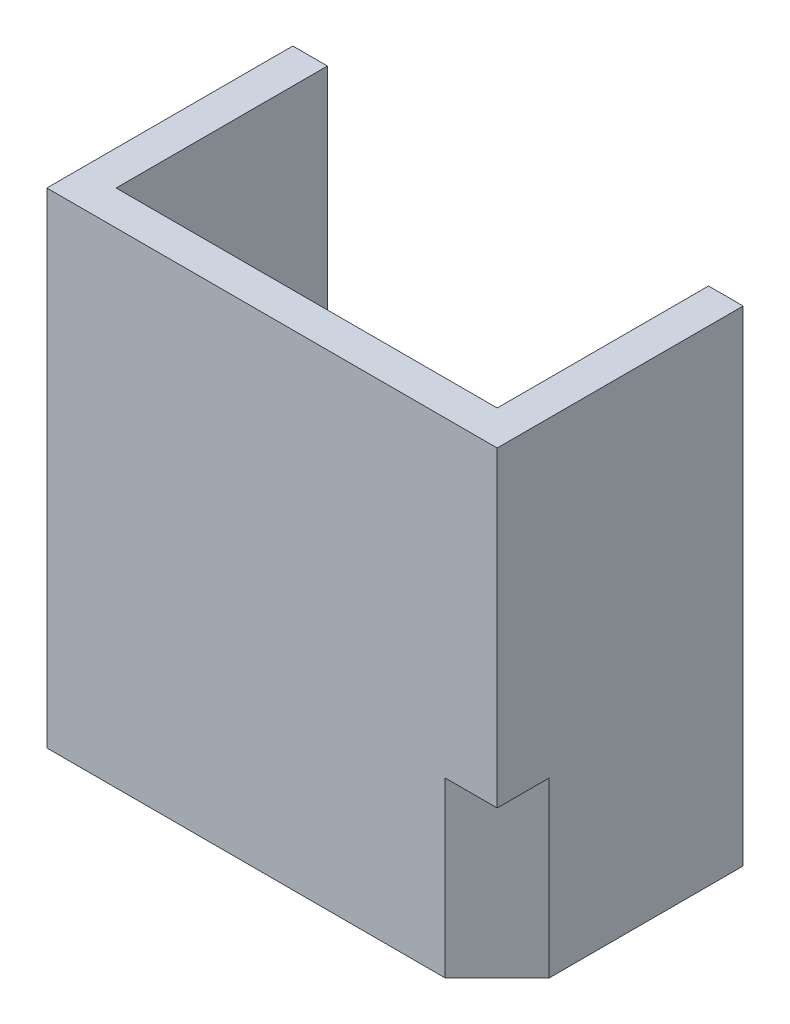
ISO-10303-21;
HEADER;
FILE_DESCRIPTION(('STEP AP214'),'2;1');
FILE_NAME('part.step','',(''),(''),'','','');
FILE_SCHEMA(('AUTOMOTIVE_DESIGN { 1 0 10303 214 1 1 1 1 }'));
ENDSEC;
DATA;
#1=APPLICATION_CONTEXT('core data for automotive mechanical design processes');
#2=APPLICATION_PROTOCOL_DEFINITION('international standard','automotive_design',2000,#1);
#3=PRODUCT_CONTEXT('',#1,'mechanical');
#4=PRODUCT('Part','Part','',(#3));
#5=PRODUCT_RELATED_PRODUCT_CATEGORY('part','',(#4));
#6=PRODUCT_DEFINITION_FORMATION('','',#4);
#7=PRODUCT_DEFINITION_CONTEXT('part definition',#1,'design');
#8=PRODUCT_DEFINITION('design','',#6,#7);
#9=PRODUCT_DEFINITION_SHAPE('','',#8);
#10=(LENGTH_UNIT() NAMED_UNIT(*) SI_UNIT(.MILLI.,.METRE.));
#11=(NAMED_UNIT(*) PLANE_ANGLE_UNIT() SI_UNIT($,.RADIAN.));
#12=(NAMED_UNIT(*) SI_UNIT($,.STERADIAN.) SOLID_ANGLE_UNIT());
#13=UNCERTAINTY_MEASURE_WITH_UNIT(LENGTH_MEASURE(1.E-05),#10,'distance_accuracy_value','');
#14=(GEOMETRIC_REPRESENTATION_CONTEXT(3) GLOBAL_UNCERTAINTY_ASSIGNED_CONTEXT((#13)) GLOBAL_UNIT_ASSIGNED_CONTEXT((#10,
#11,#12)) REPRESENTATION_CONTEXT('',''));
#15=CARTESIAN_POINT('',(0.,0.,0.));
#16=DIRECTION('',(0.,0.,1.));
#17=DIRECTION('',(1.,0.,0.));
#18=AXIS2_PLACEMENT_3D('',#15,#16,#17);
#19=CARTESIAN_POINT('',(130.,140.,0.));
#20=DIRECTION('',(-1.,0.,0.));
#21=DIRECTION('',(0.,0.,1.));
#22=AXIS2_PLACEMENT_3D('',#19,#20,#21);
#23=PLANE('',#22);
#24=DIRECTION('',(0.,-1.,0.));
#25=VECTOR('',#24,1.);
#26=CARTESIAN_POINT('',(130.,50.,-15.));
#27=LINE('',#26,#25);
#28=CARTESIAN_POINT('',(130.,50.,-15.));
#29=VERTEX_POINT('',#28);
#30=CARTESIAN_POINT('',(130.,0.,-15.));
#31=VERTEX_POINT('',#30);
#32=EDGE_CURVE('E177',#29,#31,#27,.T.);
#33=ORIENTED_EDGE('',*,*,#32,.T.);
#34=DIRECTION('',(0.,0.,-1.));
#35=VECTOR('',#34,1.);
#36=CARTESIAN_POINT('',(130.,0.,0.));
#37=LINE('',#36,#35);
#38=CARTESIAN_POINT('',(130.,0.,-71.));
#39=VERTEX_POINT('',#38);
#40=EDGE_CURVE('E290',#31,#39,#37,.T.);
#41=ORIENTED_EDGE('',*,*,#40,.T.);
#42=DIRECTION('',(0.,1.,0.));
#43=VECTOR('',#42,1.);
#44=CARTESIAN_POINT('',(130.,140.,-71.));
#45=LINE('',#44,#43);
#46=CARTESIAN_POINT('',(130.,140.,-71.));
#47=VERTEX_POINT('',#46);
#48=EDGE_CURVE('E211',#39,#47,#45,.T.);
#49=ORIENTED_EDGE('',*,*,#48,.T.);
#50=DIRECTION('',(0.,0.,-1.));
#51=VECTOR('',#50,1.);
#52=CARTESIAN_POINT('',(130.,140.,0.));
#53=LINE('',#52,#51);
#54=CARTESIAN_POINT('',(130.,140.,0.));
#55=VERTEX_POINT('',#54);
#56=EDGE_CURVE('E292',#55,#47,#53,.T.);
#57=ORIENTED_EDGE('',*,*,#56,.F.);
#58=DIRECTION('',(0.,-1.,0.));
#59=VECTOR('',#58,1.);
#60=CARTESIAN_POINT('',(130.,140.,0.));
#61=LINE('',#60,#59);
#62=CARTESIAN_POINT('',(130.,50.,0.));
#63=VERTEX_POINT('',#62);
#64=EDGE_CURVE('E194',#55,#63,#61,.T.);
#65=ORIENTED_EDGE('',*,*,#64,.T.);
#66=DIRECTION('',(0.,0.,-1.));
#67=VECTOR('',#66,1.);
#68=CARTESIAN_POINT('',(130.,50.,0.));
#69=LINE('',#68,#67);
#70=EDGE_CURVE('E64',#63,#29,#69,.T.);
#71=ORIENTED_EDGE('',*,*,#70,.T.);
#72=EDGE_LOOP('',(#33,#41,#49,#57,#65,#71));
#73=FACE_BOUND('',#72,.T.);
#74=ADVANCED_FACE('F49',(#73),#23,.F.);
#75=CARTESIAN_POINT('',(0.,0.,0.));
#76=DIRECTION('',(0.,-1.,0.));
#77=DIRECTION('',(0.,0.,-1.));
#78=AXIS2_PLACEMENT_3D('',#75,#76,#77);
#79=PLANE('',#78);
#80=ORIENTED_EDGE('',*,*,#40,.F.);
#81=DIRECTION('',(-0.707106781186547,0.,0.707106781186547));
#82=VECTOR('',#81,1.);
#83=CARTESIAN_POINT('',(130.,0.,-15.));
#84=LINE('',#83,#82);
#85=CARTESIAN_POINT('',(115.,0.,0.));
#86=VERTEX_POINT('',#85);
#87=EDGE_CURVE('E181',#31,#86,#84,.T.);
#88=ORIENTED_EDGE('',*,*,#87,.T.);
#89=DIRECTION('',(1.,0.,0.));
#90=VECTOR('',#89,1.);
#91=CARTESIAN_POINT('',(0.,0.,0.));
#92=LINE('',#91,#90);
#93=CARTESIAN_POINT('',(0.,0.,0.));
#94=VERTEX_POINT('',#93);
#95=EDGE_CURVE('E296',#94,#86,#92,.T.);
#96=ORIENTED_EDGE('',*,*,#95,.F.);
#97=DIRECTION('',(0.,0.,1.));
#98=VECTOR('',#97,1.);
#99=CARTESIAN_POINT('',(0.,0.,0.));
#100=LINE('',#99,#98);
#101=CARTESIAN_POINT('',(0.,0.,-70.9999999999999));
#102=VERTEX_POINT('',#101);
#103=EDGE_CURVE('E284',#102,#94,#100,.T.);
#104=ORIENTED_EDGE('',*,*,#103,.F.);
#105=DIRECTION('',(1.,0.,0.));
#106=VECTOR('',#105,1.);
#107=CARTESIAN_POINT('',(130.,0.,-71.));
#108=LINE('',#107,#106);
#109=CARTESIAN_POINT('',(10.,0.,-71.));
#110=VERTEX_POINT('',#109);
#111=EDGE_CURVE('E215',#102,#110,#108,.T.);
#112=ORIENTED_EDGE('',*,*,#111,.T.);
#113=DIRECTION('',(0.,0.,-1.));
#114=VECTOR('',#113,1.);
#115=CARTESIAN_POINT('',(9.99999999999999,0.,0.));
#116=LINE('',#115,#114);
#117=CARTESIAN_POINT('',(9.99999999999999,0.,-10.));
#118=VERTEX_POINT('',#117);
#119=EDGE_CURVE('E230',#118,#110,#116,.T.);
#120=ORIENTED_EDGE('',*,*,#119,.F.);
#121=DIRECTION('',(-1.,0.,0.));
#122=VECTOR('',#121,1.);
#123=CARTESIAN_POINT('',(0.,0.,-10.));
#124=LINE('',#123,#122);
#125=CARTESIAN_POINT('',(120.,0.,-10.));
#126=VERTEX_POINT('',#125);
#127=EDGE_CURVE('E234',#126,#118,#124,.T.);
#128=ORIENTED_EDGE('',*,*,#127,.F.);
#129=DIRECTION('',(0.,0.,1.));
#130=VECTOR('',#129,1.);
#131=CARTESIAN_POINT('',(120.,0.,0.));
#132=LINE('',#131,#130);
#133=CARTESIAN_POINT('',(120.,0.,-71.));
#134=VERTEX_POINT('',#133);
#135=EDGE_CURVE('E237',#134,#126,#132,.T.);
#136=ORIENTED_EDGE('',*,*,#135,.F.);
#137=EDGE_CURVE('E214',#134,#39,#108,.T.);
#138=ORIENTED_EDGE('',*,*,#137,.T.);
#139=EDGE_LOOP('',(#80,#88,#96,#104,#112,#120,#128,#136,#138));
#140=FACE_BOUND('',#139,.T.);
#141=ADVANCED_FACE('F323',(#140),#79,.T.);
#142=CARTESIAN_POINT('',(0.,140.,0.));
#143=DIRECTION('',(0.,0.,-1.));
#144=DIRECTION('',(-1.,0.,0.));
#145=AXIS2_PLACEMENT_3D('',#142,#143,#144);
#146=PLANE('',#145);
#147=DIRECTION('',(0.,-1.,0.));
#148=VECTOR('',#147,1.);
#149=CARTESIAN_POINT('',(115.,50.,0.));
#150=LINE('',#149,#148);
#151=CARTESIAN_POINT('',(115.,50.,0.));
#152=VERTEX_POINT('',#151);
#153=EDGE_CURVE('E185',#152,#86,#150,.T.);
#154=ORIENTED_EDGE('',*,*,#153,.F.);
#155=DIRECTION('',(1.,0.,0.));
#156=VECTOR('',#155,1.);
#157=CARTESIAN_POINT('',(115.,50.,0.));
#158=LINE('',#157,#156);
#159=EDGE_CURVE('E188',#152,#63,#158,.T.);
#160=ORIENTED_EDGE('',*,*,#159,.T.);
#161=ORIENTED_EDGE('',*,*,#64,.F.);
#162=DIRECTION('',(1.,0.,0.));
#163=VECTOR('',#162,1.);
#164=CARTESIAN_POINT('',(0.,140.,0.));
#165=LINE('',#164,#163);
#166=CARTESIAN_POINT('',(0.,140.,0.));
#167=VERTEX_POINT('',#166);
#168=EDGE_CURVE('E289',#167,#55,#165,.T.);
#169=ORIENTED_EDGE('',*,*,#168,.F.);
#170=DIRECTION('',(0.,-1.,0.));
#171=VECTOR('',#170,1.);
#172=CARTESIAN_POINT('',(0.,140.,0.));
#173=LINE('',#172,#171);
#174=EDGE_CURVE('E300',#167,#94,#173,.T.);
#175=ORIENTED_EDGE('',*,*,#174,.T.);
#176=ORIENTED_EDGE('',*,*,#95,.T.);
#177=EDGE_LOOP('',(#154,#160,#161,#169,#175,#176));
#178=FACE_BOUND('',#177,.T.);
#179=ADVANCED_FACE('F375',(#178),#146,.F.);
#180=CARTESIAN_POINT('',(0.,75.,0.));
#181=DIRECTION('',(0.,-1.,0.));
#182=DIRECTION('',(0.,0.,-1.));
#183=AXIS2_PLACEMENT_3D('',#180,#181,#182);
#184=PLANE('',#183);
#185=DIRECTION('',(1.,0.,0.));
#186=VECTOR('',#185,1.);
#187=CARTESIAN_POINT('',(0.,75.,-10.));
#188=LINE('',#187,#186);
#189=CARTESIAN_POINT('',(9.99999999999999,75.,-10.));
#190=VERTEX_POINT('',#189);
#191=CARTESIAN_POINT('',(19.,75.,-9.99999999999999));
#192=VERTEX_POINT('',#191);
#193=EDGE_CURVE('E264',#190,#192,#188,.T.);
#194=ORIENTED_EDGE('',*,*,#193,.T.);
#195=DIRECTION('',(0.,0.,-1.));
#196=VECTOR('',#195,1.);
#197=CARTESIAN_POINT('',(19.,75.,0.));
#198=LINE('',#197,#196);
#199=CARTESIAN_POINT('',(19.,75.,-71.));
#200=VERTEX_POINT('',#199);
#201=EDGE_CURVE('E257',#192,#200,#198,.T.);
#202=ORIENTED_EDGE('',*,*,#201,.T.);
#203=DIRECTION('',(1.,0.,0.));
#204=VECTOR('',#203,1.);
#205=CARTESIAN_POINT('',(0.,75.,-71.));
#206=LINE('',#205,#204);
#207=CARTESIAN_POINT('',(9.99999999999999,75.,-71.));
#208=VERTEX_POINT('',#207);
#209=EDGE_CURVE('E224',#208,#200,#206,.T.);
#210=ORIENTED_EDGE('',*,*,#209,.F.);
#211=DIRECTION('',(0.,0.,1.));
#212=VECTOR('',#211,1.);
#213=CARTESIAN_POINT('',(9.99999999999999,75.,0.));
#214=LINE('',#213,#212);
#215=EDGE_CURVE('E267',#208,#190,#214,.T.);
#216=ORIENTED_EDGE('',*,*,#215,.T.);
#217=EDGE_LOOP('',(#194,#202,#210,#216));
#218=FACE_BOUND('',#217,.T.);
#219=ADVANCED_FACE('F339',(#218),#184,.F.);
#220=CARTESIAN_POINT('',(0.,65.,0.));
#221=DIRECTION('',(0.,-1.,0.));
#222=DIRECTION('',(0.,0.,-1.));
#223=AXIS2_PLACEMENT_3D('',#220,#221,#222);
#224=PLANE('',#223);
#225=DIRECTION('',(0.,0.,-1.));
#226=VECTOR('',#225,1.);
#227=CARTESIAN_POINT('',(19.,65.,0.));
#228=LINE('',#227,#226);
#229=CARTESIAN_POINT('',(19.,65.,-9.99999999999999));
#230=VERTEX_POINT('',#229);
#231=CARTESIAN_POINT('',(19.,65.,-71.));
#232=VERTEX_POINT('',#231);
#233=EDGE_CURVE('E233',#230,#232,#228,.T.);
#234=ORIENTED_EDGE('',*,*,#233,.F.);
#235=DIRECTION('',(1.,0.,0.));
#236=VECTOR('',#235,1.);
#237=CARTESIAN_POINT('',(0.,65.,-10.));
#238=LINE('',#237,#236);
#239=CARTESIAN_POINT('',(9.99999999999999,65.,-10.));
#240=VERTEX_POINT('',#239);
#241=EDGE_CURVE('E244',#240,#230,#238,.T.);
#242=ORIENTED_EDGE('',*,*,#241,.F.);
#243=DIRECTION('',(0.,0.,1.));
#244=VECTOR('',#243,1.);
#245=CARTESIAN_POINT('',(9.99999999999999,65.,0.));
#246=LINE('',#245,#244);
#247=CARTESIAN_POINT('',(9.99999999999999,65.,-71.));
#248=VERTEX_POINT('',#247);
#249=EDGE_CURVE('E251',#248,#240,#246,.T.);
#250=ORIENTED_EDGE('',*,*,#249,.F.);
#251=DIRECTION('',(1.,0.,0.));
#252=VECTOR('',#251,1.);
#253=CARTESIAN_POINT('',(0.,65.,-71.));
#254=LINE('',#253,#252);
#255=EDGE_CURVE('E12',#248,#232,#254,.T.);
#256=ORIENTED_EDGE('',*,*,#255,.T.);
#257=EDGE_LOOP('',(#234,#242,#250,#256));
#258=FACE_BOUND('',#257,.T.);
#259=ADVANCED_FACE('F333',(#258),#224,.T.);
#260=CARTESIAN_POINT('',(120.,0.,-10.));
#261=DIRECTION('',(1.,0.,0.));
#262=DIRECTION('',(0.,0.,-1.));
#263=AXIS2_PLACEMENT_3D('',#260,#261,#262);
#264=PLANE('',#263);
#265=DIRECTION('',(0.,1.,0.));
#266=VECTOR('',#265,1.);
#267=CARTESIAN_POINT('',(120.,0.,-71.));
#268=LINE('',#267,#266);
#269=CARTESIAN_POINT('',(120.,75.,-71.));
#270=VERTEX_POINT('',#269);
#271=CARTESIAN_POINT('',(120.,140.,-71.));
#272=VERTEX_POINT('',#271);
#273=EDGE_CURVE('E227',#270,#272,#268,.T.);
#274=ORIENTED_EDGE('',*,*,#273,.F.);
#275=DIRECTION('',(0.,0.,-1.));
#276=VECTOR('',#275,1.);
#277=CARTESIAN_POINT('',(120.,75.,0.));
#278=LINE('',#277,#276);
#279=CARTESIAN_POINT('',(120.,75.,-10.));
#280=VERTEX_POINT('',#279);
#281=EDGE_CURVE('E260',#280,#270,#278,.T.);
#282=ORIENTED_EDGE('',*,*,#281,.F.);
#283=DIRECTION('',(0.,1.,0.));
#284=VECTOR('',#283,1.);
#285=CARTESIAN_POINT('',(120.,0.,-10.));
#286=LINE('',#285,#284);
#287=CARTESIAN_POINT('',(120.,140.,-10.));
#288=VERTEX_POINT('',#287);
#289=EDGE_CURVE('E282',#280,#288,#286,.T.);
#290=ORIENTED_EDGE('',*,*,#289,.T.);
#291=DIRECTION('',(0.,0.,-1.));
#292=VECTOR('',#291,1.);
#293=CARTESIAN_POINT('',(120.,140.,-10.));
#294=LINE('',#293,#292);
#295=EDGE_CURVE('E278',#288,#272,#294,.T.);
#296=ORIENTED_EDGE('',*,*,#295,.T.);
#297=EDGE_LOOP('',(#274,#282,#290,#296));
#298=FACE_BOUND('',#297,.T.);
#299=ADVANCED_FACE('F352',(#298),#264,.F.);
#300=CARTESIAN_POINT('',(10.,0.,-80.));
#301=DIRECTION('',(-1.,0.,0.));
#302=DIRECTION('',(0.,0.,1.));
#303=AXIS2_PLACEMENT_3D('',#300,#301,#302);
#304=PLANE('',#303);
#305=DIRECTION('',(0.,-1.,0.));
#306=VECTOR('',#305,1.);
#307=CARTESIAN_POINT('',(10.,0.,-71.));
#308=LINE('',#307,#306);
#309=CARTESIAN_POINT('',(10.,140.,-71.));
#310=VERTEX_POINT('',#309);
#311=EDGE_CURVE('E225',#310,#208,#308,.T.);
#312=ORIENTED_EDGE('',*,*,#311,.F.);
#313=DIRECTION('',(0.,0.,1.));
#314=VECTOR('',#313,1.);
#315=CARTESIAN_POINT('',(10.,140.,-80.));
#316=LINE('',#315,#314);
#317=CARTESIAN_POINT('',(9.99999999999999,140.,-10.));
#318=VERTEX_POINT('',#317);
#319=EDGE_CURVE('E272',#310,#318,#316,.T.);
#320=ORIENTED_EDGE('',*,*,#319,.T.);
#321=DIRECTION('',(0.,1.,0.));
#322=VECTOR('',#321,1.);
#323=CARTESIAN_POINT('',(9.99999999999999,0.,-10.));
#324=LINE('',#323,#322);
#325=EDGE_CURVE('E281',#190,#318,#324,.T.);
#326=ORIENTED_EDGE('',*,*,#325,.F.);
#327=ORIENTED_EDGE('',*,*,#215,.F.);
#328=EDGE_LOOP('',(#312,#320,#326,#327));
#329=FACE_BOUND('',#328,.T.);
#330=ADVANCED_FACE('F409',(#329),#304,.F.);
#331=CARTESIAN_POINT('',(0.,140.,0.));
#332=DIRECTION('',(1.,0.,0.));
#333=DIRECTION('',(0.,0.,-1.));
#334=AXIS2_PLACEMENT_3D('',#331,#332,#333);
#335=PLANE('',#334);
#336=DIRECTION('',(0.,-1.,0.));
#337=VECTOR('',#336,1.);
#338=CARTESIAN_POINT('',(0.,140.,-71.));
#339=LINE('',#338,#337);
#340=CARTESIAN_POINT('',(0.,140.,-71.));
#341=VERTEX_POINT('',#340);
#342=EDGE_CURVE('E202',#341,#102,#339,.T.);
#343=ORIENTED_EDGE('',*,*,#342,.T.);
#344=ORIENTED_EDGE('',*,*,#103,.T.);
#345=ORIENTED_EDGE('',*,*,#174,.F.);
#346=DIRECTION('',(0.,0.,1.));
#347=VECTOR('',#346,1.);
#348=CARTESIAN_POINT('',(0.,140.,0.));
#349=LINE('',#348,#347);
#350=EDGE_CURVE('E287',#341,#167,#349,.T.);
#351=ORIENTED_EDGE('',*,*,#350,.F.);
#352=EDGE_LOOP('',(#343,#344,#345,#351));
#353=FACE_BOUND('',#352,.T.);
#354=ADVANCED_FACE('F51',(#353),#335,.F.);
#355=CARTESIAN_POINT('',(0.,140.,0.));
#356=DIRECTION('',(0.,-1.,0.));
#357=DIRECTION('',(0.,0.,-1.));
#358=AXIS2_PLACEMENT_3D('',#355,#356,#357);
#359=PLANE('',#358);
#360=DIRECTION('',(-1.,0.,0.));
#361=VECTOR('',#360,1.);
#362=CARTESIAN_POINT('',(130.,140.,-71.));
#363=LINE('',#362,#361);
#364=EDGE_CURVE('E207',#310,#341,#363,.T.);
#365=ORIENTED_EDGE('',*,*,#364,.T.);
#366=ORIENTED_EDGE('',*,*,#350,.T.);
#367=ORIENTED_EDGE('',*,*,#168,.T.);
#368=ORIENTED_EDGE('',*,*,#56,.T.);
#369=EDGE_CURVE('E208',#47,#272,#363,.T.);
#370=ORIENTED_EDGE('',*,*,#369,.T.);
#371=ORIENTED_EDGE('',*,*,#295,.F.);
#372=DIRECTION('',(1.,0.,0.));
#373=VECTOR('',#372,1.);
#374=CARTESIAN_POINT('',(9.99999999999999,140.,-10.));
#375=LINE('',#374,#373);
#376=EDGE_CURVE('E275',#318,#288,#375,.T.);
#377=ORIENTED_EDGE('',*,*,#376,.F.);
#378=ORIENTED_EDGE('',*,*,#319,.F.);
#379=EDGE_LOOP('',(#365,#366,#367,#368,#370,#371,#377,#378));
#380=FACE_BOUND('',#379,.T.);
#381=ADVANCED_FACE('F349',(#380),#359,.F.);
#382=DIRECTION('',(0.,0.,1.));
#383=VECTOR('',#382,1.);
#384=CARTESIAN_POINT('',(111.,75.,0.));
#385=LINE('',#384,#383);
#386=CARTESIAN_POINT('',(111.,75.,-71.));
#387=VERTEX_POINT('',#386);
#388=CARTESIAN_POINT('',(111.,75.,-9.99999999999999));
#389=VERTEX_POINT('',#388);
#390=EDGE_CURVE('E243',#387,#389,#385,.T.);
#391=ORIENTED_EDGE('',*,*,#390,.T.);
#392=EDGE_CURVE('E263',#389,#280,#188,.T.);
#393=ORIENTED_EDGE('',*,*,#392,.T.);
#394=ORIENTED_EDGE('',*,*,#281,.T.);
#395=EDGE_CURVE('E222',#387,#270,#206,.T.);
#396=ORIENTED_EDGE('',*,*,#395,.F.);
#397=EDGE_LOOP('',(#391,#393,#394,#396));
#398=FACE_BOUND('',#397,.T.);
#399=ADVANCED_FACE('F356',(#398),#184,.F.);
#400=CARTESIAN_POINT('',(9.99999999999999,205.384048104053,0.));
#401=DIRECTION('',(-1.,0.,0.));
#402=DIRECTION('',(0.,0.,1.));
#403=AXIS2_PLACEMENT_3D('',#400,#401,#402);
#404=PLANE('',#403);
#405=DIRECTION('',(0.,-1.,0.));
#406=VECTOR('',#405,1.);
#407=CARTESIAN_POINT('',(10.,205.384048104053,-71.));
#408=LINE('',#407,#406);
#409=EDGE_CURVE('E220',#248,#110,#408,.T.);
#410=ORIENTED_EDGE('',*,*,#409,.F.);
#411=ORIENTED_EDGE('',*,*,#249,.T.);
#412=DIRECTION('',(0.,-1.,0.));
#413=VECTOR('',#412,1.);
#414=CARTESIAN_POINT('',(9.99999999999999,205.384048104053,-10.));
#415=LINE('',#414,#413);
#416=EDGE_CURVE('E229',#240,#118,#415,.T.);
#417=ORIENTED_EDGE('',*,*,#416,.T.);
#418=ORIENTED_EDGE('',*,*,#119,.T.);
#419=EDGE_LOOP('',(#410,#411,#417,#418));
#420=FACE_BOUND('',#419,.T.);
#421=ADVANCED_FACE('F328',(#420),#404,.F.);
#422=CARTESIAN_POINT('',(120.,205.384048104053,0.));
#423=DIRECTION('',(1.,0.,0.));
#424=DIRECTION('',(0.,0.,-1.));
#425=AXIS2_PLACEMENT_3D('',#422,#423,#424);
#426=PLANE('',#425);
#427=DIRECTION('',(0.,1.,0.));
#428=VECTOR('',#427,1.);
#429=CARTESIAN_POINT('',(120.,205.384048104053,-71.));
#430=LINE('',#429,#428);
#431=CARTESIAN_POINT('',(120.,65.,-71.));
#432=VERTEX_POINT('',#431);
#433=EDGE_CURVE('E218',#134,#432,#430,.T.);
#434=ORIENTED_EDGE('',*,*,#433,.F.);
#435=ORIENTED_EDGE('',*,*,#135,.T.);
#436=DIRECTION('',(0.,-1.,0.));
#437=VECTOR('',#436,1.);
#438=CARTESIAN_POINT('',(120.,205.384048104053,-10.));
#439=LINE('',#438,#437);
#440=CARTESIAN_POINT('',(120.,65.,-10.));
#441=VERTEX_POINT('',#440);
#442=EDGE_CURVE('E239',#441,#126,#439,.T.);
#443=ORIENTED_EDGE('',*,*,#442,.F.);
#444=DIRECTION('',(0.,0.,-1.));
#445=VECTOR('',#444,1.);
#446=CARTESIAN_POINT('',(120.,65.,0.));
#447=LINE('',#446,#445);
#448=EDGE_CURVE('E240',#441,#432,#447,.T.);
#449=ORIENTED_EDGE('',*,*,#448,.T.);
#450=EDGE_LOOP('',(#434,#435,#443,#449));
#451=FACE_BOUND('',#450,.T.);
#452=ADVANCED_FACE('F314',(#451),#426,.F.);
#453=CARTESIAN_POINT('',(111.,65.,-10.));
#454=VERTEX_POINT('',#453);
#455=EDGE_CURVE('E253',#454,#441,#238,.T.);
#456=ORIENTED_EDGE('',*,*,#455,.F.);
#457=DIRECTION('',(0.,0.,1.));
#458=VECTOR('',#457,1.);
#459=CARTESIAN_POINT('',(111.,65.,0.));
#460=LINE('',#459,#458);
#461=CARTESIAN_POINT('',(111.,65.,-71.));
#462=VERTEX_POINT('',#461);
#463=EDGE_CURVE('E72',#462,#454,#460,.T.);
#464=ORIENTED_EDGE('',*,*,#463,.F.);
#465=EDGE_CURVE('E53',#462,#432,#254,.T.);
#466=ORIENTED_EDGE('',*,*,#465,.T.);
#467=ORIENTED_EDGE('',*,*,#448,.F.);
#468=EDGE_LOOP('',(#456,#464,#466,#467));
#469=FACE_BOUND('',#468,.T.);
#470=ADVANCED_FACE('F309',(#469),#224,.T.);
#471=CARTESIAN_POINT('',(19.,75.,0.));
#472=DIRECTION('',(-1.,0.,0.));
#473=DIRECTION('',(0.,0.,1.));
#474=AXIS2_PLACEMENT_3D('',#471,#472,#473);
#475=PLANE('',#474);
#476=ORIENTED_EDGE('',*,*,#233,.T.);
#477=DIRECTION('',(0.,-1.,0.));
#478=VECTOR('',#477,1.);
#479=CARTESIAN_POINT('',(19.,75.,-71.));
#480=LINE('',#479,#478);
#481=EDGE_CURVE('E270',#200,#232,#480,.T.);
#482=ORIENTED_EDGE('',*,*,#481,.F.);
#483=ORIENTED_EDGE('',*,*,#201,.F.);
#484=DIRECTION('',(0.,1.,0.));
#485=VECTOR('',#484,1.);
#486=CARTESIAN_POINT('',(19.,75.,-9.99999999999999));
#487=LINE('',#486,#485);
#488=EDGE_CURVE('E184',#230,#192,#487,.T.);
#489=ORIENTED_EDGE('',*,*,#488,.F.);
#490=EDGE_LOOP('',(#476,#482,#483,#489));
#491=FACE_BOUND('',#490,.T.);
#492=ADVANCED_FACE('F336',(#491),#475,.F.);
#493=CARTESIAN_POINT('',(111.,75.,0.));
#494=DIRECTION('',(1.,0.,0.));
#495=DIRECTION('',(0.,0.,-1.));
#496=AXIS2_PLACEMENT_3D('',#493,#494,#495);
#497=PLANE('',#496);
#498=ORIENTED_EDGE('',*,*,#463,.T.);
#499=DIRECTION('',(0.,-1.,0.));
#500=VECTOR('',#499,1.);
#501=CARTESIAN_POINT('',(111.,75.,-9.99999999999999));
#502=LINE('',#501,#500);
#503=EDGE_CURVE('E200',#389,#454,#502,.T.);
#504=ORIENTED_EDGE('',*,*,#503,.F.);
#505=ORIENTED_EDGE('',*,*,#390,.F.);
#506=DIRECTION('',(0.,-1.,0.));
#507=VECTOR('',#506,1.);
#508=CARTESIAN_POINT('',(111.,75.,-71.));
#509=LINE('',#508,#507);
#510=EDGE_CURVE('E269',#387,#462,#509,.T.);
#511=ORIENTED_EDGE('',*,*,#510,.T.);
#512=EDGE_LOOP('',(#498,#504,#505,#511));
#513=FACE_BOUND('',#512,.T.);
#514=ADVANCED_FACE('F359',(#513),#497,.F.);
#515=CARTESIAN_POINT('',(9.99999999999999,0.,-10.));
#516=DIRECTION('',(0.,0.,1.));
#517=DIRECTION('',(1.,0.,0.));
#518=AXIS2_PLACEMENT_3D('',#515,#516,#517);
#519=PLANE('',#518);
#520=ORIENTED_EDGE('',*,*,#193,.F.);
#521=ORIENTED_EDGE('',*,*,#325,.T.);
#522=ORIENTED_EDGE('',*,*,#376,.T.);
#523=ORIENTED_EDGE('',*,*,#289,.F.);
#524=ORIENTED_EDGE('',*,*,#392,.F.);
#525=ORIENTED_EDGE('',*,*,#503,.T.);
#526=ORIENTED_EDGE('',*,*,#455,.T.);
#527=ORIENTED_EDGE('',*,*,#442,.T.);
#528=ORIENTED_EDGE('',*,*,#127,.T.);
#529=ORIENTED_EDGE('',*,*,#416,.F.);
#530=ORIENTED_EDGE('',*,*,#241,.T.);
#531=ORIENTED_EDGE('',*,*,#488,.T.);
#532=EDGE_LOOP('',(#520,#521,#522,#523,#524,#525,#526,#527,#528,#529,#530,#531));
#533=FACE_BOUND('',#532,.T.);
#534=ADVANCED_FACE('F319',(#533),#519,.F.);
#535=CARTESIAN_POINT('',(0.,75.,-71.));
#536=DIRECTION('',(0.,0.,-1.));
#537=DIRECTION('',(-1.,0.,0.));
#538=AXIS2_PLACEMENT_3D('',#535,#536,#537);
#539=PLANE('',#538);
#540=ORIENTED_EDGE('',*,*,#510,.F.);
#541=ORIENTED_EDGE('',*,*,#395,.T.);
#542=ORIENTED_EDGE('',*,*,#273,.T.);
#543=ORIENTED_EDGE('',*,*,#369,.F.);
#544=ORIENTED_EDGE('',*,*,#48,.F.);
#545=ORIENTED_EDGE('',*,*,#137,.F.);
#546=ORIENTED_EDGE('',*,*,#433,.T.);
#547=ORIENTED_EDGE('',*,*,#465,.F.);
#548=EDGE_LOOP('',(#540,#541,#542,#543,#544,#545,#546,#547));
#549=FACE_BOUND('',#548,.T.);
#550=ADVANCED_FACE('F366',(#549),#539,.T.);
#551=ORIENTED_EDGE('',*,*,#481,.T.);
#552=ORIENTED_EDGE('',*,*,#255,.F.);
#553=ORIENTED_EDGE('',*,*,#409,.T.);
#554=ORIENTED_EDGE('',*,*,#111,.F.);
#555=ORIENTED_EDGE('',*,*,#342,.F.);
#556=ORIENTED_EDGE('',*,*,#364,.F.);
#557=ORIENTED_EDGE('',*,*,#311,.T.);
#558=ORIENTED_EDGE('',*,*,#209,.T.);
#559=EDGE_LOOP('',(#551,#552,#553,#554,#555,#556,#557,#558));
#560=FACE_BOUND('',#559,.T.);
#561=ADVANCED_FACE('F387',(#560),#539,.T.);
#562=CARTESIAN_POINT('',(130.,50.,-15.));
#563=DIRECTION('',(0.707106781186547,0.,0.707106781186547));
#564=DIRECTION('',(0.707106781186548,0.,-0.707106781186548));
#565=AXIS2_PLACEMENT_3D('',#562,#563,#564);
#566=PLANE('',#565);
#567=ORIENTED_EDGE('',*,*,#87,.F.);
#568=ORIENTED_EDGE('',*,*,#32,.F.);
#569=DIRECTION('',(-0.707106781186547,0.,0.707106781186547));
#570=VECTOR('',#569,1.);
#571=CARTESIAN_POINT('',(130.,50.,-15.));
#572=LINE('',#571,#570);
#573=EDGE_CURVE('E179',#29,#152,#572,.T.);
#574=ORIENTED_EDGE('',*,*,#573,.T.);
#575=ORIENTED_EDGE('',*,*,#153,.T.);
#576=EDGE_LOOP('',(#567,#568,#574,#575));
#577=FACE_BOUND('',#576,.T.);
#578=ADVANCED_FACE('F178',(#577),#566,.T.);
#579=CARTESIAN_POINT('',(0.,50.,0.));
#580=DIRECTION('',(0.,1.,0.));
#581=DIRECTION('',(0.,0.,1.));
#582=AXIS2_PLACEMENT_3D('',#579,#580,#581);
#583=PLANE('',#582);
#584=ORIENTED_EDGE('',*,*,#159,.F.);
#585=ORIENTED_EDGE('',*,*,#573,.F.);
#586=ORIENTED_EDGE('',*,*,#70,.F.);
#587=EDGE_LOOP('',(#584,#585,#586));
#588=FACE_BOUND('',#587,.T.);
#589=ADVANCED_FACE('F187',(#588),#583,.F.);
#590=CLOSED_SHELL('',(#74,#141,#179,#219,#259,#299,#330,#354,#381,#399,#421,#452,#470,#492,#514,
#534,#550,#561,#578,#589));
#591=MANIFOLD_SOLID_BREP('B2',#590);
#592=ADVANCED_BREP_SHAPE_REPRESENTATION('',(#18,#591),#14);
#593=SHAPE_DEFINITION_REPRESENTATION(#9,#592);
ENDSEC;
END-ISO-10303-21;
